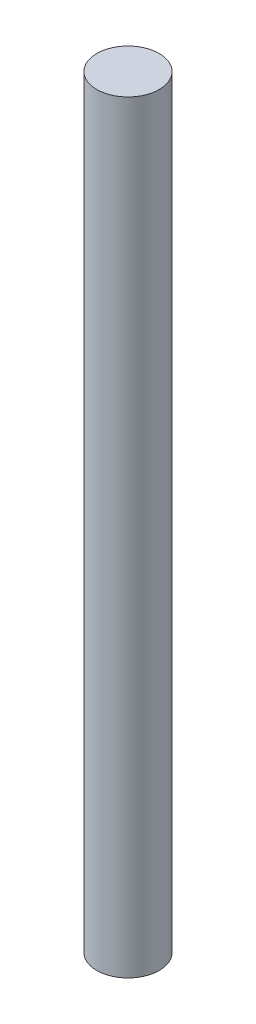
ISO-10303-21;
HEADER;
FILE_DESCRIPTION(('STEP AP214'),'2;1');
FILE_NAME('part.step','',(''),(''),'','','');
FILE_SCHEMA(('AUTOMOTIVE_DESIGN { 1 0 10303 214 1 1 1 1 }'));
ENDSEC;
DATA;
#1=APPLICATION_CONTEXT('core data for automotive mechanical design processes');
#2=APPLICATION_PROTOCOL_DEFINITION('international standard','automotive_design',2000,#1);
#3=PRODUCT_CONTEXT('',#1,'mechanical');
#4=PRODUCT('Part','Part','',(#3));
#5=PRODUCT_RELATED_PRODUCT_CATEGORY('part','',(#4));
#6=PRODUCT_DEFINITION_FORMATION('','',#4);
#7=PRODUCT_DEFINITION_CONTEXT('part definition',#1,'design');
#8=PRODUCT_DEFINITION('design','',#6,#7);
#9=PRODUCT_DEFINITION_SHAPE('','',#8);
#10=(LENGTH_UNIT() NAMED_UNIT(*) SI_UNIT(.MILLI.,.METRE.));
#11=(NAMED_UNIT(*) PLANE_ANGLE_UNIT() SI_UNIT($,.RADIAN.));
#12=(NAMED_UNIT(*) SI_UNIT($,.STERADIAN.) SOLID_ANGLE_UNIT());
#13=UNCERTAINTY_MEASURE_WITH_UNIT(LENGTH_MEASURE(1.E-05),#10,'distance_accuracy_value','');
#14=(GEOMETRIC_REPRESENTATION_CONTEXT(3) GLOBAL_UNCERTAINTY_ASSIGNED_CONTEXT((#13)) GLOBAL_UNIT_ASSIGNED_CONTEXT((#10,
#11,#12)) REPRESENTATION_CONTEXT('',''));
#15=CARTESIAN_POINT('',(0.,0.,0.));
#16=DIRECTION('',(0.,0.,1.));
#17=DIRECTION('',(1.,0.,0.));
#18=AXIS2_PLACEMENT_3D('',#15,#16,#17);
#19=CARTESIAN_POINT('',(0.,0.,0.));
#20=DIRECTION('',(0.,1.,0.));
#21=DIRECTION('',(0.,0.,1.));
#22=AXIS2_PLACEMENT_3D('',#19,#20,#21);
#23=PLANE('',#22);
#24=CARTESIAN_POINT('',(0.,0.,0.));
#25=DIRECTION('',(0.,1.,0.));
#26=DIRECTION('',(0.,0.,1.));
#27=AXIS2_PLACEMENT_3D('',#24,#25,#26);
#28=CIRCLE('',#27,6.75);
#29=CARTESIAN_POINT('',(0.,0.,6.75));
#30=VERTEX_POINT('',#29);
#31=EDGE_CURVE('E39',#30,#30,#28,.T.);
#32=ORIENTED_EDGE('',*,*,#31,.F.);
#33=EDGE_LOOP('',(#32));
#34=FACE_BOUND('',#33,.T.);
#35=ADVANCED_FACE('F32',(#34),#23,.F.);
#36=CARTESIAN_POINT('',(0.,165.,0.));
#37=DIRECTION('',(0.,1.,0.));
#38=DIRECTION('',(0.,0.,1.));
#39=AXIS2_PLACEMENT_3D('',#36,#37,#38);
#40=PLANE('',#39);
#41=CARTESIAN_POINT('',(0.,165.,0.));
#42=DIRECTION('',(0.,1.,0.));
#43=DIRECTION('',(0.,0.,1.));
#44=AXIS2_PLACEMENT_3D('',#41,#42,#43);
#45=CIRCLE('',#44,6.75);
#46=CARTESIAN_POINT('',(0.,165.,6.75));
#47=VERTEX_POINT('',#46);
#48=EDGE_CURVE('E11',#47,#47,#45,.T.);
#49=ORIENTED_EDGE('',*,*,#48,.T.);
#50=EDGE_LOOP('',(#49));
#51=FACE_BOUND('',#50,.T.);
#52=ADVANCED_FACE('F46',(#51),#40,.T.);
#53=CARTESIAN_POINT('',(0.,0.,0.));
#54=DIRECTION('',(0.,1.,0.));
#55=DIRECTION('',(0.,0.,1.));
#56=AXIS2_PLACEMENT_3D('',#53,#54,#55);
#57=CYLINDRICAL_SURFACE('',#56,6.75);
#58=ORIENTED_EDGE('',*,*,#48,.F.);
#59=EDGE_LOOP('',(#58));
#60=FACE_BOUND('',#59,.T.);
#61=ORIENTED_EDGE('',*,*,#31,.T.);
#62=EDGE_LOOP('',(#61));
#63=FACE_BOUND('',#62,.T.);
#64=ADVANCED_FACE('F48',(#60,#63),#57,.T.);
#65=CLOSED_SHELL('',(#35,#52,#64));
#66=MANIFOLD_SOLID_BREP('B2',#65);
#67=ADVANCED_BREP_SHAPE_REPRESENTATION('',(#18,#66),#14);
#68=SHAPE_DEFINITION_REPRESENTATION(#9,#67);
ENDSEC;
END-ISO-10303-21;
